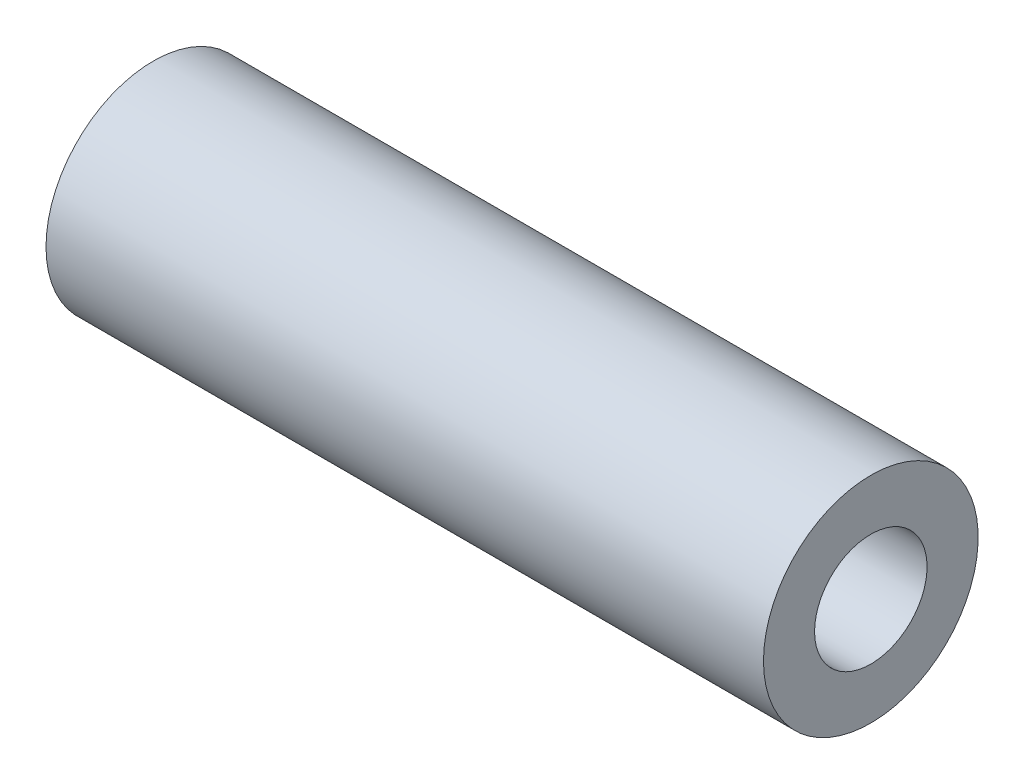
ISO-10303-21;
HEADER;
FILE_DESCRIPTION(('STEP AP214'),'2;1');
FILE_NAME('part.step','',(''),(''),'','','');
FILE_SCHEMA(('AUTOMOTIVE_DESIGN { 1 0 10303 214 1 1 1 1 }'));
ENDSEC;
DATA;
#1=APPLICATION_CONTEXT('core data for automotive mechanical design processes');
#2=APPLICATION_PROTOCOL_DEFINITION('international standard','automotive_design',2000,#1);
#3=PRODUCT_CONTEXT('',#1,'mechanical');
#4=PRODUCT('Part','Part','',(#3));
#5=PRODUCT_RELATED_PRODUCT_CATEGORY('part','',(#4));
#6=PRODUCT_DEFINITION_FORMATION('','',#4);
#7=PRODUCT_DEFINITION_CONTEXT('part definition',#1,'design');
#8=PRODUCT_DEFINITION('design','',#6,#7);
#9=PRODUCT_DEFINITION_SHAPE('','',#8);
#10=(LENGTH_UNIT() NAMED_UNIT(*) SI_UNIT(.MILLI.,.METRE.));
#11=(NAMED_UNIT(*) PLANE_ANGLE_UNIT() SI_UNIT($,.RADIAN.));
#12=(NAMED_UNIT(*) SI_UNIT($,.STERADIAN.) SOLID_ANGLE_UNIT());
#13=UNCERTAINTY_MEASURE_WITH_UNIT(LENGTH_MEASURE(1.E-05),#10,'distance_accuracy_value','');
#14=(GEOMETRIC_REPRESENTATION_CONTEXT(3) GLOBAL_UNCERTAINTY_ASSIGNED_CONTEXT((#13)) GLOBAL_UNIT_ASSIGNED_CONTEXT((#10,
#11,#12)) REPRESENTATION_CONTEXT('',''));
#15=CARTESIAN_POINT('',(0.,0.,0.));
#16=DIRECTION('',(0.,0.,1.));
#17=DIRECTION('',(1.,0.,0.));
#18=AXIS2_PLACEMENT_3D('',#15,#16,#17);
#19=CARTESIAN_POINT('',(15.875,0.,0.));
#20=DIRECTION('',(-1.,0.,0.));
#21=DIRECTION('',(0.,0.,1.));
#22=AXIS2_PLACEMENT_3D('',#19,#20,#21);
#23=CYLINDRICAL_SURFACE('',#22,2.4892);
#24=CARTESIAN_POINT('',(-15.875,0.,0.));
#25=DIRECTION('',(-1.,0.,0.));
#26=DIRECTION('',(0.,0.,1.));
#27=AXIS2_PLACEMENT_3D('',#24,#25,#26);
#28=CIRCLE('',#27,2.4892);
#29=CARTESIAN_POINT('',(-15.875,0.,2.4892));
#30=VERTEX_POINT('',#29);
#31=EDGE_CURVE('E26',#30,#30,#28,.T.);
#32=ORIENTED_EDGE('',*,*,#31,.T.);
#33=EDGE_LOOP('',(#32));
#34=FACE_BOUND('',#33,.T.);
#35=CARTESIAN_POINT('',(15.875,0.,0.));
#36=DIRECTION('',(-1.,0.,0.));
#37=DIRECTION('',(0.,0.,1.));
#38=AXIS2_PLACEMENT_3D('',#35,#36,#37);
#39=CIRCLE('',#38,2.4892);
#40=CARTESIAN_POINT('',(15.875,0.,2.4892));
#41=VERTEX_POINT('',#40);
#42=EDGE_CURVE('E17',#41,#41,#39,.T.);
#43=ORIENTED_EDGE('',*,*,#42,.F.);
#44=EDGE_LOOP('',(#43));
#45=FACE_BOUND('',#44,.T.);
#46=ADVANCED_FACE('F14',(#34,#45),#23,.F.);
#47=CARTESIAN_POINT('',(15.875,0.,0.));
#48=DIRECTION('',(1.,0.,0.));
#49=DIRECTION('',(0.,0.,-1.));
#50=AXIS2_PLACEMENT_3D('',#47,#48,#49);
#51=PLANE('',#50);
#52=ORIENTED_EDGE('',*,*,#42,.T.);
#53=EDGE_LOOP('',(#52));
#54=FACE_BOUND('',#53,.T.);
#55=CARTESIAN_POINT('',(15.875,0.,0.));
#56=DIRECTION('',(-1.,0.,0.));
#57=DIRECTION('',(0.,0.,1.));
#58=AXIS2_PLACEMENT_3D('',#55,#56,#57);
#59=CIRCLE('',#58,4.7498);
#60=CARTESIAN_POINT('',(15.875,0.,4.7498));
#61=VERTEX_POINT('',#60);
#62=EDGE_CURVE('E21',#61,#61,#59,.T.);
#63=ORIENTED_EDGE('',*,*,#62,.F.);
#64=EDGE_LOOP('',(#63));
#65=FACE_BOUND('',#64,.T.);
#66=ADVANCED_FACE('F34',(#54,#65),#51,.T.);
#67=CARTESIAN_POINT('',(-15.875,0.,0.));
#68=DIRECTION('',(1.,0.,0.));
#69=DIRECTION('',(0.,0.,-1.));
#70=AXIS2_PLACEMENT_3D('',#67,#68,#69);
#71=PLANE('',#70);
#72=ORIENTED_EDGE('',*,*,#31,.F.);
#73=EDGE_LOOP('',(#72));
#74=FACE_BOUND('',#73,.T.);
#75=CARTESIAN_POINT('',(-15.875,0.,0.));
#76=DIRECTION('',(-1.,0.,0.));
#77=DIRECTION('',(0.,0.,1.));
#78=AXIS2_PLACEMENT_3D('',#75,#76,#77);
#79=CIRCLE('',#78,4.7498);
#80=CARTESIAN_POINT('',(-15.875,0.,4.7498));
#81=VERTEX_POINT('',#80);
#82=EDGE_CURVE('E10',#81,#81,#79,.F.);
#83=ORIENTED_EDGE('',*,*,#82,.F.);
#84=EDGE_LOOP('',(#83));
#85=FACE_BOUND('',#84,.T.);
#86=ADVANCED_FACE('F42',(#74,#85),#71,.F.);
#87=CARTESIAN_POINT('',(15.875,0.,0.));
#88=DIRECTION('',(-1.,0.,0.));
#89=DIRECTION('',(0.,0.,1.));
#90=AXIS2_PLACEMENT_3D('',#87,#88,#89);
#91=CYLINDRICAL_SURFACE('',#90,4.7498);
#92=ORIENTED_EDGE('',*,*,#82,.T.);
#93=EDGE_LOOP('',(#92));
#94=FACE_BOUND('',#93,.T.);
#95=ORIENTED_EDGE('',*,*,#62,.T.);
#96=EDGE_LOOP('',(#95));
#97=FACE_BOUND('',#96,.T.);
#98=ADVANCED_FACE('F43',(#94,#97),#91,.T.);
#99=CLOSED_SHELL('',(#46,#66,#86,#98));
#100=MANIFOLD_SOLID_BREP('B1',#99);
#101=ADVANCED_BREP_SHAPE_REPRESENTATION('',(#18,#100),#14);
#102=SHAPE_DEFINITION_REPRESENTATION(#9,#101);
ENDSEC;
END-ISO-10303-21;
